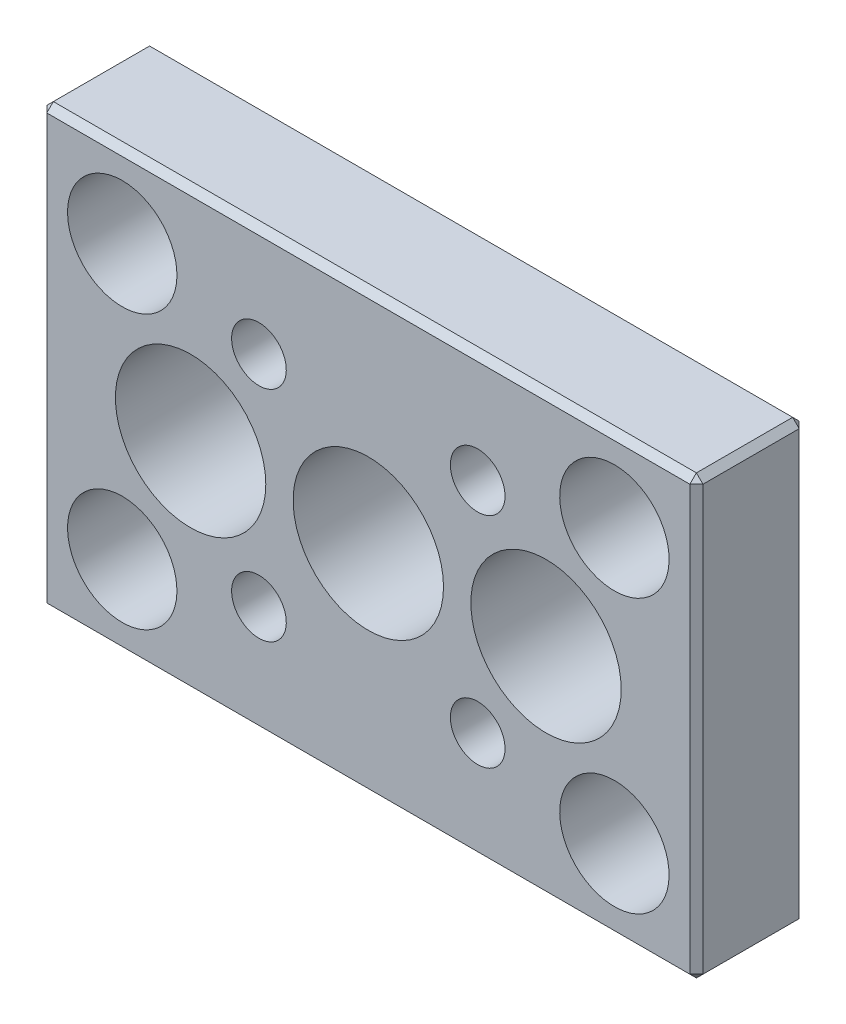
ISO-10303-21;
HEADER;
FILE_DESCRIPTION(('STEP AP214'),'2;1');
FILE_NAME('part.step','',(''),(''),'','','');
FILE_SCHEMA(('AUTOMOTIVE_DESIGN { 1 0 10303 214 1 1 1 1 }'));
ENDSEC;
DATA;
#1=APPLICATION_CONTEXT('core data for automotive mechanical design processes');
#2=APPLICATION_PROTOCOL_DEFINITION('international standard','automotive_design',2000,#1);
#3=PRODUCT_CONTEXT('',#1,'mechanical');
#4=PRODUCT('Part','Part','',(#3));
#5=PRODUCT_RELATED_PRODUCT_CATEGORY('part','',(#4));
#6=PRODUCT_DEFINITION_FORMATION('','',#4);
#7=PRODUCT_DEFINITION_CONTEXT('part definition',#1,'design');
#8=PRODUCT_DEFINITION('design','',#6,#7);
#9=PRODUCT_DEFINITION_SHAPE('','',#8);
#10=(LENGTH_UNIT() NAMED_UNIT(*) SI_UNIT(.MILLI.,.METRE.));
#11=(NAMED_UNIT(*) PLANE_ANGLE_UNIT() SI_UNIT($,.RADIAN.));
#12=(NAMED_UNIT(*) SI_UNIT($,.STERADIAN.) SOLID_ANGLE_UNIT());
#13=UNCERTAINTY_MEASURE_WITH_UNIT(LENGTH_MEASURE(1.E-05),#10,'distance_accuracy_value','');
#14=(GEOMETRIC_REPRESENTATION_CONTEXT(3) GLOBAL_UNCERTAINTY_ASSIGNED_CONTEXT((#13)) GLOBAL_UNIT_ASSIGNED_CONTEXT((#10,
#11,#12)) REPRESENTATION_CONTEXT('',''));
#15=CARTESIAN_POINT('',(0.,0.,0.));
#16=DIRECTION('',(0.,0.,1.));
#17=DIRECTION('',(1.,0.,0.));
#18=AXIS2_PLACEMENT_3D('',#15,#16,#17);
#19=CARTESIAN_POINT('',(-76.2,50.8,-25.4));
#20=DIRECTION('',(-1.,0.,0.));
#21=DIRECTION('',(0.,-1.,0.));
#22=AXIS2_PLACEMENT_3D('',#19,#20,#21);
#23=PLANE('',#22);
#24=DIRECTION('',(0.,0.,1.));
#25=VECTOR('',#24,1.);
#26=CARTESIAN_POINT('',(-76.2,-49.276,-25.4));
#27=LINE('',#26,#25);
#28=CARTESIAN_POINT('',(-76.2,-49.276,-23.876));
#29=VERTEX_POINT('',#28);
#30=CARTESIAN_POINT('',(-76.2,-49.276,-1.524));
#31=VERTEX_POINT('',#30);
#32=EDGE_CURVE('E191',#29,#31,#27,.T.);
#33=ORIENTED_EDGE('',*,*,#32,.T.);
#34=DIRECTION('',(0.,1.,0.));
#35=VECTOR('',#34,1.);
#36=CARTESIAN_POINT('',(-76.2,50.8,-1.524));
#37=LINE('',#36,#35);
#38=CARTESIAN_POINT('',(-76.2,49.276,-1.524));
#39=VERTEX_POINT('',#38);
#40=EDGE_CURVE('E197',#31,#39,#37,.T.);
#41=ORIENTED_EDGE('',*,*,#40,.T.);
#42=DIRECTION('',(0.,0.,-1.));
#43=VECTOR('',#42,1.);
#44=CARTESIAN_POINT('',(-76.2,49.276,-25.4));
#45=LINE('',#44,#43);
#46=CARTESIAN_POINT('',(-76.2,49.276,-23.876));
#47=VERTEX_POINT('',#46);
#48=EDGE_CURVE('E195',#39,#47,#45,.T.);
#49=ORIENTED_EDGE('',*,*,#48,.T.);
#50=DIRECTION('',(0.,-1.,0.));
#51=VECTOR('',#50,1.);
#52=CARTESIAN_POINT('',(-76.2,-50.8,-23.876));
#53=LINE('',#52,#51);
#54=EDGE_CURVE('E193',#47,#29,#53,.T.);
#55=ORIENTED_EDGE('',*,*,#54,.T.);
#56=EDGE_LOOP('',(#33,#41,#49,#55));
#57=FACE_BOUND('',#56,.T.);
#58=ADVANCED_FACE('F36',(#57),#23,.T.);
#59=CARTESIAN_POINT('',(-76.2,50.8,-25.4));
#60=DIRECTION('',(0.,1.,0.));
#61=DIRECTION('',(0.,0.,1.));
#62=AXIS2_PLACEMENT_3D('',#59,#60,#61);
#63=PLANE('',#62);
#64=DIRECTION('',(0.,0.,1.));
#65=VECTOR('',#64,1.);
#66=CARTESIAN_POINT('',(-74.676,50.8,-25.4));
#67=LINE('',#66,#65);
#68=CARTESIAN_POINT('',(-74.676,50.8,-23.876));
#69=VERTEX_POINT('',#68);
#70=CARTESIAN_POINT('',(-74.676,50.8,-1.52400000000001));
#71=VERTEX_POINT('',#70);
#72=EDGE_CURVE('E162',#69,#71,#67,.T.);
#73=ORIENTED_EDGE('',*,*,#72,.T.);
#74=DIRECTION('',(1.,0.,0.));
#75=VECTOR('',#74,1.);
#76=CARTESIAN_POINT('',(-76.2,50.8,-1.52400000000001));
#77=LINE('',#76,#75);
#78=CARTESIAN_POINT('',(74.676,50.8,-1.52400000000001));
#79=VERTEX_POINT('',#78);
#80=EDGE_CURVE('E131',#71,#79,#77,.T.);
#81=ORIENTED_EDGE('',*,*,#80,.T.);
#82=DIRECTION('',(0.,0.,-1.));
#83=VECTOR('',#82,1.);
#84=CARTESIAN_POINT('',(74.676,50.8,-25.4));
#85=LINE('',#84,#83);
#86=CARTESIAN_POINT('',(74.676,50.8,-23.876));
#87=VERTEX_POINT('',#86);
#88=EDGE_CURVE('E170',#79,#87,#85,.T.);
#89=ORIENTED_EDGE('',*,*,#88,.T.);
#90=DIRECTION('',(-1.,0.,0.));
#91=VECTOR('',#90,1.);
#92=CARTESIAN_POINT('',(-76.2,50.8,-23.876));
#93=LINE('',#92,#91);
#94=EDGE_CURVE('E164',#87,#69,#93,.T.);
#95=ORIENTED_EDGE('',*,*,#94,.T.);
#96=EDGE_LOOP('',(#73,#81,#89,#95));
#97=FACE_BOUND('',#96,.T.);
#98=ADVANCED_FACE('F291',(#97),#63,.T.);
#99=CARTESIAN_POINT('',(76.2,50.8,-25.4));
#100=DIRECTION('',(1.,0.,0.));
#101=DIRECTION('',(0.,1.,0.));
#102=AXIS2_PLACEMENT_3D('',#99,#100,#101);
#103=PLANE('',#102);
#104=DIRECTION('',(0.,0.,1.));
#105=VECTOR('',#104,1.);
#106=CARTESIAN_POINT('',(76.2,49.276,-25.4));
#107=LINE('',#106,#105);
#108=CARTESIAN_POINT('',(76.2,49.276,-23.876));
#109=VERTEX_POINT('',#108);
#110=CARTESIAN_POINT('',(76.2,49.276,-1.52400000000001));
#111=VERTEX_POINT('',#110);
#112=EDGE_CURVE('E173',#109,#111,#107,.T.);
#113=ORIENTED_EDGE('',*,*,#112,.T.);
#114=DIRECTION('',(0.,-1.,0.));
#115=VECTOR('',#114,1.);
#116=CARTESIAN_POINT('',(76.2,50.8,-1.52400000000001));
#117=LINE('',#116,#115);
#118=CARTESIAN_POINT('',(76.2,-49.276,-1.52400000000001));
#119=VERTEX_POINT('',#118);
#120=EDGE_CURVE('E179',#111,#119,#117,.T.);
#121=ORIENTED_EDGE('',*,*,#120,.T.);
#122=DIRECTION('',(0.,0.,-1.));
#123=VECTOR('',#122,1.);
#124=CARTESIAN_POINT('',(76.2,-49.276,-25.4));
#125=LINE('',#124,#123);
#126=CARTESIAN_POINT('',(76.2,-49.276,-23.876));
#127=VERTEX_POINT('',#126);
#128=EDGE_CURVE('E177',#119,#127,#125,.T.);
#129=ORIENTED_EDGE('',*,*,#128,.T.);
#130=DIRECTION('',(0.,1.,0.));
#131=VECTOR('',#130,1.);
#132=CARTESIAN_POINT('',(76.2,50.8,-23.876));
#133=LINE('',#132,#131);
#134=EDGE_CURVE('E175',#127,#109,#133,.T.);
#135=ORIENTED_EDGE('',*,*,#134,.T.);
#136=EDGE_LOOP('',(#113,#121,#129,#135));
#137=FACE_BOUND('',#136,.T.);
#138=ADVANCED_FACE('F297',(#137),#103,.T.);
#139=CARTESIAN_POINT('',(-76.2,-50.8,-25.4));
#140=DIRECTION('',(0.,-1.,0.));
#141=DIRECTION('',(0.,0.,-1.));
#142=AXIS2_PLACEMENT_3D('',#139,#140,#141);
#143=PLANE('',#142);
#144=DIRECTION('',(1.,0.,0.));
#145=VECTOR('',#144,1.);
#146=CARTESIAN_POINT('',(76.2,-50.8,-23.876));
#147=LINE('',#146,#145);
#148=CARTESIAN_POINT('',(-74.6759999999999,-50.8,-23.876));
#149=VERTEX_POINT('',#148);
#150=CARTESIAN_POINT('',(74.676,-50.8,-23.876));
#151=VERTEX_POINT('',#150);
#152=EDGE_CURVE('E184',#149,#151,#147,.T.);
#153=ORIENTED_EDGE('',*,*,#152,.T.);
#154=DIRECTION('',(0.,0.,1.));
#155=VECTOR('',#154,1.);
#156=CARTESIAN_POINT('',(74.676,-50.8,-25.4));
#157=LINE('',#156,#155);
#158=CARTESIAN_POINT('',(74.676,-50.8,-1.52400000000001));
#159=VERTEX_POINT('',#158);
#160=EDGE_CURVE('E189',#151,#159,#157,.T.);
#161=ORIENTED_EDGE('',*,*,#160,.T.);
#162=DIRECTION('',(-1.,0.,0.));
#163=VECTOR('',#162,1.);
#164=CARTESIAN_POINT('',(-76.2,-50.8,-1.52400000000001));
#165=LINE('',#164,#163);
#166=CARTESIAN_POINT('',(-74.6759999999999,-50.8,-1.52400000000001));
#167=VERTEX_POINT('',#166);
#168=EDGE_CURVE('E186',#159,#167,#165,.T.);
#169=ORIENTED_EDGE('',*,*,#168,.T.);
#170=DIRECTION('',(0.,0.,-1.));
#171=VECTOR('',#170,1.);
#172=CARTESIAN_POINT('',(-74.6759999999999,-50.8,-25.4));
#173=LINE('',#172,#171);
#174=EDGE_CURVE('E182',#167,#149,#173,.T.);
#175=ORIENTED_EDGE('',*,*,#174,.T.);
#176=EDGE_LOOP('',(#153,#161,#169,#175));
#177=FACE_BOUND('',#176,.T.);
#178=ADVANCED_FACE('F284',(#177),#143,.T.);
#179=CARTESIAN_POINT('',(-76.2,-50.8,-25.4));
#180=DIRECTION('',(0.,0.,1.));
#181=DIRECTION('',(1.,0.,0.));
#182=AXIS2_PLACEMENT_3D('',#179,#180,#181);
#183=PLANE('',#182);
#184=CARTESIAN_POINT('',(0.,0.,-25.4));
#185=DIRECTION('',(0.,0.,1.));
#186=DIRECTION('',(1.,0.,0.));
#187=AXIS2_PLACEMENT_3D('',#184,#185,#186);
#188=CIRCLE('',#187,17.4625);
#189=CARTESIAN_POINT('',(17.4625,0.,-25.4));
#190=VERTEX_POINT('',#189);
#191=EDGE_CURVE('E683',#190,#190,#188,.T.);
#192=ORIENTED_EDGE('',*,*,#191,.T.);
#193=EDGE_LOOP('',(#192));
#194=FACE_BOUND('',#193,.T.);
#195=CARTESIAN_POINT('',(41.275,0.,-25.4));
#196=DIRECTION('',(0.,0.,1.));
#197=DIRECTION('',(1.,0.,0.));
#198=AXIS2_PLACEMENT_3D('',#195,#196,#197);
#199=CIRCLE('',#198,17.4625);
#200=CARTESIAN_POINT('',(58.7375,0.,-25.4));
#201=VERTEX_POINT('',#200);
#202=EDGE_CURVE('E134',#201,#201,#199,.T.);
#203=ORIENTED_EDGE('',*,*,#202,.T.);
#204=EDGE_LOOP('',(#203));
#205=FACE_BOUND('',#204,.T.);
#206=DIRECTION('',(0.,-1.,0.));
#207=VECTOR('',#206,1.);
#208=CARTESIAN_POINT('',(74.676,-50.8,-25.4));
#209=LINE('',#208,#207);
#210=CARTESIAN_POINT('',(74.676,49.276,-25.4));
#211=VERTEX_POINT('',#210);
#212=CARTESIAN_POINT('',(74.676,-49.276,-25.4));
#213=VERTEX_POINT('',#212);
#214=EDGE_CURVE('E51',#211,#213,#209,.T.);
#215=ORIENTED_EDGE('',*,*,#214,.T.);
#216=DIRECTION('',(-1.,0.,0.));
#217=VECTOR('',#216,1.);
#218=CARTESIAN_POINT('',(-76.2,-49.276,-25.4));
#219=LINE('',#218,#217);
#220=CARTESIAN_POINT('',(-74.6759999999999,-49.276,-25.4));
#221=VERTEX_POINT('',#220);
#222=EDGE_CURVE('E204',#213,#221,#219,.T.);
#223=ORIENTED_EDGE('',*,*,#222,.T.);
#224=DIRECTION('',(0.,1.,0.));
#225=VECTOR('',#224,1.);
#226=CARTESIAN_POINT('',(-74.676,50.8,-25.4));
#227=LINE('',#226,#225);
#228=CARTESIAN_POINT('',(-74.676,49.276,-25.4));
#229=VERTEX_POINT('',#228);
#230=EDGE_CURVE('E200',#221,#229,#227,.T.);
#231=ORIENTED_EDGE('',*,*,#230,.T.);
#232=DIRECTION('',(1.,0.,0.));
#233=VECTOR('',#232,1.);
#234=CARTESIAN_POINT('',(76.2,49.276,-25.4));
#235=LINE('',#234,#233);
#236=EDGE_CURVE('E56',#229,#211,#235,.T.);
#237=ORIENTED_EDGE('',*,*,#236,.T.);
#238=EDGE_LOOP('',(#215,#223,#231,#237));
#239=FACE_BOUND('',#238,.T.);
#240=CARTESIAN_POINT('',(-57.15,31.75,-25.4));
#241=DIRECTION('',(0.,0.,-1.));
#242=DIRECTION('',(0.,1.,0.));
#243=AXIS2_PLACEMENT_3D('',#240,#241,#242);
#244=CIRCLE('',#243,12.7);
#245=CARTESIAN_POINT('',(-57.15,44.45,-25.4));
#246=VERTEX_POINT('',#245);
#247=EDGE_CURVE('E262',#246,#246,#244,.T.);
#248=ORIENTED_EDGE('',*,*,#247,.F.);
#249=EDGE_LOOP('',(#248));
#250=FACE_BOUND('',#249,.T.);
#251=CARTESIAN_POINT('',(57.15,31.75,-25.4));
#252=DIRECTION('',(0.,0.,-1.));
#253=DIRECTION('',(0.,1.,0.));
#254=AXIS2_PLACEMENT_3D('',#251,#252,#253);
#255=CIRCLE('',#254,12.7);
#256=CARTESIAN_POINT('',(57.15,44.45,-25.4));
#257=VERTEX_POINT('',#256);
#258=EDGE_CURVE('E665',#257,#257,#255,.T.);
#259=ORIENTED_EDGE('',*,*,#258,.F.);
#260=EDGE_LOOP('',(#259));
#261=FACE_BOUND('',#260,.T.);
#262=CARTESIAN_POINT('',(-57.15,-31.75,-25.4));
#263=DIRECTION('',(0.,0.,-1.));
#264=DIRECTION('',(0.,1.,0.));
#265=AXIS2_PLACEMENT_3D('',#262,#263,#264);
#266=CIRCLE('',#265,12.7);
#267=CARTESIAN_POINT('',(-57.15,-19.05,-25.4));
#268=VERTEX_POINT('',#267);
#269=EDGE_CURVE('E659',#268,#268,#266,.T.);
#270=ORIENTED_EDGE('',*,*,#269,.F.);
#271=EDGE_LOOP('',(#270));
#272=FACE_BOUND('',#271,.T.);
#273=CARTESIAN_POINT('',(57.15,-31.75,-25.4));
#274=DIRECTION('',(0.,0.,-1.));
#275=DIRECTION('',(0.,1.,0.));
#276=AXIS2_PLACEMENT_3D('',#273,#274,#275);
#277=CIRCLE('',#276,12.7);
#278=CARTESIAN_POINT('',(57.15,-19.05,-25.4));
#279=VERTEX_POINT('',#278);
#280=EDGE_CURVE('E653',#279,#279,#277,.T.);
#281=ORIENTED_EDGE('',*,*,#280,.F.);
#282=EDGE_LOOP('',(#281));
#283=FACE_BOUND('',#282,.T.);
#284=CARTESIAN_POINT('',(25.4,25.4,-25.4));
#285=DIRECTION('',(0.,0.,-1.));
#286=DIRECTION('',(0.,1.,0.));
#287=AXIS2_PLACEMENT_3D('',#284,#285,#286);
#288=CIRCLE('',#287,6.35);
#289=CARTESIAN_POINT('',(25.4,31.75,-25.4));
#290=VERTEX_POINT('',#289);
#291=EDGE_CURVE('E615',#290,#290,#288,.T.);
#292=ORIENTED_EDGE('',*,*,#291,.F.);
#293=EDGE_LOOP('',(#292));
#294=FACE_BOUND('',#293,.T.);
#295=CARTESIAN_POINT('',(-25.4,25.4,-25.4));
#296=DIRECTION('',(0.,0.,-1.));
#297=DIRECTION('',(0.,1.,0.));
#298=AXIS2_PLACEMENT_3D('',#295,#296,#297);
#299=CIRCLE('',#298,6.35);
#300=CARTESIAN_POINT('',(-25.4,31.75,-25.4));
#301=VERTEX_POINT('',#300);
#302=EDGE_CURVE('E617',#301,#301,#299,.T.);
#303=ORIENTED_EDGE('',*,*,#302,.F.);
#304=EDGE_LOOP('',(#303));
#305=FACE_BOUND('',#304,.T.);
#306=CARTESIAN_POINT('',(-25.4,-25.4,-25.4));
#307=DIRECTION('',(0.,0.,-1.));
#308=DIRECTION('',(0.,1.,0.));
#309=AXIS2_PLACEMENT_3D('',#306,#307,#308);
#310=CIRCLE('',#309,6.35);
#311=CARTESIAN_POINT('',(-25.4,-19.05,-25.4));
#312=VERTEX_POINT('',#311);
#313=EDGE_CURVE('E631',#312,#312,#310,.T.);
#314=ORIENTED_EDGE('',*,*,#313,.F.);
#315=EDGE_LOOP('',(#314));
#316=FACE_BOUND('',#315,.T.);
#317=CARTESIAN_POINT('',(25.4,-25.4,-25.4));
#318=DIRECTION('',(0.,0.,-1.));
#319=DIRECTION('',(0.,1.,0.));
#320=AXIS2_PLACEMENT_3D('',#317,#318,#319);
#321=CIRCLE('',#320,6.35);
#322=CARTESIAN_POINT('',(25.4,-19.05,-25.4));
#323=VERTEX_POINT('',#322);
#324=EDGE_CURVE('E155',#323,#323,#321,.T.);
#325=ORIENTED_EDGE('',*,*,#324,.F.);
#326=EDGE_LOOP('',(#325));
#327=FACE_BOUND('',#326,.T.);
#328=CARTESIAN_POINT('',(-41.275,0.,-25.4));
#329=DIRECTION('',(0.,0.,1.));
#330=DIRECTION('',(1.,0.,0.));
#331=AXIS2_PLACEMENT_3D('',#328,#329,#330);
#332=CIRCLE('',#331,17.4625);
#333=CARTESIAN_POINT('',(-23.8125,0.,-25.4));
#334=VERTEX_POINT('',#333);
#335=EDGE_CURVE('E44',#334,#334,#332,.T.);
#336=ORIENTED_EDGE('',*,*,#335,.T.);
#337=EDGE_LOOP('',(#336));
#338=FACE_BOUND('',#337,.T.);
#339=ADVANCED_FACE('F266',(#194,#205,#239,#250,#261,#272,#283,#294,#305,#316,#327,#338),#183,.F.);
#340=CARTESIAN_POINT('',(-76.2,-50.8,0.));
#341=DIRECTION('',(0.,0.,1.));
#342=DIRECTION('',(1.,0.,0.));
#343=AXIS2_PLACEMENT_3D('',#340,#341,#342);
#344=PLANE('',#343);
#345=CARTESIAN_POINT('',(0.,0.,0.));
#346=DIRECTION('',(0.,0.,1.));
#347=DIRECTION('',(1.,0.,0.));
#348=AXIS2_PLACEMENT_3D('',#345,#346,#347);
#349=CIRCLE('',#348,17.4625);
#350=CARTESIAN_POINT('',(17.4625,0.,0.));
#351=VERTEX_POINT('',#350);
#352=EDGE_CURVE('E678',#351,#351,#349,.T.);
#353=ORIENTED_EDGE('',*,*,#352,.F.);
#354=EDGE_LOOP('',(#353));
#355=FACE_BOUND('',#354,.T.);
#356=CARTESIAN_POINT('',(41.275,0.,0.));
#357=DIRECTION('',(0.,0.,1.));
#358=DIRECTION('',(1.,0.,0.));
#359=AXIS2_PLACEMENT_3D('',#356,#357,#358);
#360=CIRCLE('',#359,17.4625);
#361=CARTESIAN_POINT('',(58.7375,0.,0.));
#362=VERTEX_POINT('',#361);
#363=EDGE_CURVE('E675',#362,#362,#360,.T.);
#364=ORIENTED_EDGE('',*,*,#363,.F.);
#365=EDGE_LOOP('',(#364));
#366=FACE_BOUND('',#365,.T.);
#367=DIRECTION('',(0.,1.,0.));
#368=VECTOR('',#367,1.);
#369=CARTESIAN_POINT('',(74.676,-50.8,0.));
#370=LINE('',#369,#368);
#371=CARTESIAN_POINT('',(74.676,-49.276,0.));
#372=VERTEX_POINT('',#371);
#373=CARTESIAN_POINT('',(74.676,49.276,0.));
#374=VERTEX_POINT('',#373);
#375=EDGE_CURVE('E160',#372,#374,#370,.T.);
#376=ORIENTED_EDGE('',*,*,#375,.T.);
#377=DIRECTION('',(-1.,0.,0.));
#378=VECTOR('',#377,1.);
#379=CARTESIAN_POINT('',(-76.2,49.276,0.));
#380=LINE('',#379,#378);
#381=CARTESIAN_POINT('',(-74.676,49.276,0.));
#382=VERTEX_POINT('',#381);
#383=EDGE_CURVE('E129',#374,#382,#380,.T.);
#384=ORIENTED_EDGE('',*,*,#383,.T.);
#385=DIRECTION('',(0.,-1.,0.));
#386=VECTOR('',#385,1.);
#387=CARTESIAN_POINT('',(-74.6759999999999,-50.8,0.));
#388=LINE('',#387,#386);
#389=CARTESIAN_POINT('',(-74.6759999999999,-49.276,0.));
#390=VERTEX_POINT('',#389);
#391=EDGE_CURVE('E148',#382,#390,#388,.T.);
#392=ORIENTED_EDGE('',*,*,#391,.T.);
#393=DIRECTION('',(1.,0.,0.));
#394=VECTOR('',#393,1.);
#395=CARTESIAN_POINT('',(-76.2,-49.276,0.));
#396=LINE('',#395,#394);
#397=EDGE_CURVE('E154',#390,#372,#396,.T.);
#398=ORIENTED_EDGE('',*,*,#397,.T.);
#399=EDGE_LOOP('',(#376,#384,#392,#398));
#400=FACE_BOUND('',#399,.T.);
#401=CARTESIAN_POINT('',(-57.15,31.75,0.));
#402=DIRECTION('',(0.,0.,-1.));
#403=DIRECTION('',(0.,1.,0.));
#404=AXIS2_PLACEMENT_3D('',#401,#402,#403);
#405=CIRCLE('',#404,12.7);
#406=CARTESIAN_POINT('',(-57.15,44.45,0.));
#407=VERTEX_POINT('',#406);
#408=EDGE_CURVE('E668',#407,#407,#405,.T.);
#409=ORIENTED_EDGE('',*,*,#408,.T.);
#410=EDGE_LOOP('',(#409));
#411=FACE_BOUND('',#410,.T.);
#412=CARTESIAN_POINT('',(57.15,31.75,0.));
#413=DIRECTION('',(0.,0.,-1.));
#414=DIRECTION('',(0.,1.,0.));
#415=AXIS2_PLACEMENT_3D('',#412,#413,#414);
#416=CIRCLE('',#415,12.7);
#417=CARTESIAN_POINT('',(57.15,44.45,0.));
#418=VERTEX_POINT('',#417);
#419=EDGE_CURVE('E662',#418,#418,#416,.T.);
#420=ORIENTED_EDGE('',*,*,#419,.T.);
#421=EDGE_LOOP('',(#420));
#422=FACE_BOUND('',#421,.T.);
#423=CARTESIAN_POINT('',(-57.15,-31.75,0.));
#424=DIRECTION('',(0.,0.,-1.));
#425=DIRECTION('',(0.,1.,0.));
#426=AXIS2_PLACEMENT_3D('',#423,#424,#425);
#427=CIRCLE('',#426,12.7);
#428=CARTESIAN_POINT('',(-57.15,-19.05,0.));
#429=VERTEX_POINT('',#428);
#430=EDGE_CURVE('E656',#429,#429,#427,.T.);
#431=ORIENTED_EDGE('',*,*,#430,.T.);
#432=EDGE_LOOP('',(#431));
#433=FACE_BOUND('',#432,.T.);
#434=CARTESIAN_POINT('',(57.15,-31.75,0.));
#435=DIRECTION('',(0.,0.,-1.));
#436=DIRECTION('',(0.,1.,0.));
#437=AXIS2_PLACEMENT_3D('',#434,#435,#436);
#438=CIRCLE('',#437,12.7);
#439=CARTESIAN_POINT('',(57.15,-19.05,0.));
#440=VERTEX_POINT('',#439);
#441=EDGE_CURVE('E622',#440,#440,#438,.T.);
#442=ORIENTED_EDGE('',*,*,#441,.T.);
#443=EDGE_LOOP('',(#442));
#444=FACE_BOUND('',#443,.T.);
#445=CARTESIAN_POINT('',(25.4,25.4,0.));
#446=DIRECTION('',(0.,0.,-1.));
#447=DIRECTION('',(0.,1.,0.));
#448=AXIS2_PLACEMENT_3D('',#445,#446,#447);
#449=CIRCLE('',#448,6.35);
#450=CARTESIAN_POINT('',(25.4,31.75,0.));
#451=VERTEX_POINT('',#450);
#452=EDGE_CURVE('E612',#451,#451,#449,.T.);
#453=ORIENTED_EDGE('',*,*,#452,.T.);
#454=EDGE_LOOP('',(#453));
#455=FACE_BOUND('',#454,.T.);
#456=CARTESIAN_POINT('',(-25.4,25.4,0.));
#457=DIRECTION('',(0.,0.,-1.));
#458=DIRECTION('',(0.,1.,0.));
#459=AXIS2_PLACEMENT_3D('',#456,#457,#458);
#460=CIRCLE('',#459,6.35);
#461=CARTESIAN_POINT('',(-25.4,31.75,0.));
#462=VERTEX_POINT('',#461);
#463=EDGE_CURVE('E620',#462,#462,#460,.T.);
#464=ORIENTED_EDGE('',*,*,#463,.T.);
#465=EDGE_LOOP('',(#464));
#466=FACE_BOUND('',#465,.T.);
#467=CARTESIAN_POINT('',(-25.4,-25.4,0.));
#468=DIRECTION('',(0.,0.,-1.));
#469=DIRECTION('',(0.,1.,0.));
#470=AXIS2_PLACEMENT_3D('',#467,#468,#469);
#471=CIRCLE('',#470,6.35);
#472=CARTESIAN_POINT('',(-25.4,-19.05,0.));
#473=VERTEX_POINT('',#472);
#474=EDGE_CURVE('E627',#473,#473,#471,.T.);
#475=ORIENTED_EDGE('',*,*,#474,.T.);
#476=EDGE_LOOP('',(#475));
#477=FACE_BOUND('',#476,.T.);
#478=CARTESIAN_POINT('',(25.4,-25.4,0.));
#479=DIRECTION('',(0.,0.,-1.));
#480=DIRECTION('',(0.,1.,0.));
#481=AXIS2_PLACEMENT_3D('',#478,#479,#480);
#482=CIRCLE('',#481,6.35);
#483=CARTESIAN_POINT('',(25.4,-19.05,0.));
#484=VERTEX_POINT('',#483);
#485=EDGE_CURVE('E634',#484,#484,#482,.T.);
#486=ORIENTED_EDGE('',*,*,#485,.T.);
#487=EDGE_LOOP('',(#486));
#488=FACE_BOUND('',#487,.T.);
#489=CARTESIAN_POINT('',(-41.275,0.,0.));
#490=DIRECTION('',(0.,0.,1.));
#491=DIRECTION('',(1.,0.,0.));
#492=AXIS2_PLACEMENT_3D('',#489,#490,#491);
#493=CIRCLE('',#492,17.4625);
#494=CARTESIAN_POINT('',(-23.8125,0.,0.));
#495=VERTEX_POINT('',#494);
#496=EDGE_CURVE('E11',#495,#495,#493,.T.);
#497=ORIENTED_EDGE('',*,*,#496,.F.);
#498=EDGE_LOOP('',(#497));
#499=FACE_BOUND('',#498,.T.);
#500=ADVANCED_FACE('F157',(#355,#366,#400,#411,#422,#433,#444,#455,#466,#477,#488,#499),#344,.T.);
#501=CARTESIAN_POINT('',(-25.4,25.4,0.));
#502=DIRECTION('',(0.,0.,-1.));
#503=DIRECTION('',(0.,1.,0.));
#504=AXIS2_PLACEMENT_3D('',#501,#502,#503);
#505=CYLINDRICAL_SURFACE('',#504,6.35);
#506=ORIENTED_EDGE('',*,*,#463,.F.);
#507=EDGE_LOOP('',(#506));
#508=FACE_BOUND('',#507,.T.);
#509=ORIENTED_EDGE('',*,*,#302,.T.);
#510=EDGE_LOOP('',(#509));
#511=FACE_BOUND('',#510,.T.);
#512=ADVANCED_FACE('F274',(#508,#511),#505,.F.);
#513=CARTESIAN_POINT('',(25.4,25.4,0.));
#514=DIRECTION('',(0.,0.,-1.));
#515=DIRECTION('',(0.,1.,0.));
#516=AXIS2_PLACEMENT_3D('',#513,#514,#515);
#517=CYLINDRICAL_SURFACE('',#516,6.35);
#518=ORIENTED_EDGE('',*,*,#452,.F.);
#519=EDGE_LOOP('',(#518));
#520=FACE_BOUND('',#519,.T.);
#521=ORIENTED_EDGE('',*,*,#291,.T.);
#522=EDGE_LOOP('',(#521));
#523=FACE_BOUND('',#522,.T.);
#524=ADVANCED_FACE('F281',(#520,#523),#517,.F.);
#525=CARTESIAN_POINT('',(-25.4,-25.4,0.));
#526=DIRECTION('',(0.,0.,-1.));
#527=DIRECTION('',(0.,1.,0.));
#528=AXIS2_PLACEMENT_3D('',#525,#526,#527);
#529=CYLINDRICAL_SURFACE('',#528,6.35);
#530=ORIENTED_EDGE('',*,*,#474,.F.);
#531=EDGE_LOOP('',(#530));
#532=FACE_BOUND('',#531,.T.);
#533=ORIENTED_EDGE('',*,*,#313,.T.);
#534=EDGE_LOOP('',(#533));
#535=FACE_BOUND('',#534,.T.);
#536=ADVANCED_FACE('F302',(#532,#535),#529,.F.);
#537=CARTESIAN_POINT('',(25.4,-25.4,0.));
#538=DIRECTION('',(0.,0.,-1.));
#539=DIRECTION('',(0.,1.,0.));
#540=AXIS2_PLACEMENT_3D('',#537,#538,#539);
#541=CYLINDRICAL_SURFACE('',#540,6.35);
#542=ORIENTED_EDGE('',*,*,#485,.F.);
#543=EDGE_LOOP('',(#542));
#544=FACE_BOUND('',#543,.T.);
#545=ORIENTED_EDGE('',*,*,#324,.T.);
#546=EDGE_LOOP('',(#545));
#547=FACE_BOUND('',#546,.T.);
#548=ADVANCED_FACE('F305',(#544,#547),#541,.F.);
#549=CARTESIAN_POINT('',(57.15,-31.75,0.));
#550=DIRECTION('',(0.,0.,-1.));
#551=DIRECTION('',(0.,1.,0.));
#552=AXIS2_PLACEMENT_3D('',#549,#550,#551);
#553=CYLINDRICAL_SURFACE('',#552,12.7);
#554=ORIENTED_EDGE('',*,*,#441,.F.);
#555=EDGE_LOOP('',(#554));
#556=FACE_BOUND('',#555,.T.);
#557=ORIENTED_EDGE('',*,*,#280,.T.);
#558=EDGE_LOOP('',(#557));
#559=FACE_BOUND('',#558,.T.);
#560=ADVANCED_FACE('F309',(#556,#559),#553,.F.);
#561=CARTESIAN_POINT('',(-57.15,-31.75,0.));
#562=DIRECTION('',(0.,0.,-1.));
#563=DIRECTION('',(0.,1.,0.));
#564=AXIS2_PLACEMENT_3D('',#561,#562,#563);
#565=CYLINDRICAL_SURFACE('',#564,12.7);
#566=CARTESIAN_POINT('',(-57.15,-19.05,0.));
#567=CARTESIAN_POINT('',(-57.15,-19.05,-0.264583333333327));
#568=CARTESIAN_POINT('',(-57.15,-19.05,-0.529166666666661));
#569=CARTESIAN_POINT('',(-57.15,-19.05,-1.05833333333333));
#570=CARTESIAN_POINT('',(-57.15,-19.05,-1.32291666666666));
#571=CARTESIAN_POINT('',(-57.15,-19.05,-1.85208333333333));
#572=CARTESIAN_POINT('',(-57.15,-19.05,-2.11666666666666));
#573=CARTESIAN_POINT('',(-57.15,-19.05,-2.64583333333333));
#574=CARTESIAN_POINT('',(-57.15,-19.05,-2.91041666666666));
#575=CARTESIAN_POINT('',(-57.15,-19.05,-3.43958333333333));
#576=CARTESIAN_POINT('',(-57.15,-19.05,-3.70416666666666));
#577=CARTESIAN_POINT('',(-57.15,-19.05,-4.23333333333333));
#578=CARTESIAN_POINT('',(-57.15,-19.05,-4.49791666666666));
#579=CARTESIAN_POINT('',(-57.15,-19.05,-5.02708333333333));
#580=CARTESIAN_POINT('',(-57.15,-19.05,-5.29166666666666));
#581=CARTESIAN_POINT('',(-57.15,-19.05,-5.82083333333333));
#582=CARTESIAN_POINT('',(-57.15,-19.05,-6.08541666666666));
#583=CARTESIAN_POINT('',(-57.15,-19.05,-6.61458333333333));
#584=CARTESIAN_POINT('',(-57.15,-19.05,-6.87916666666666));
#585=CARTESIAN_POINT('',(-57.15,-19.05,-7.40833333333333));
#586=CARTESIAN_POINT('',(-57.15,-19.05,-7.67291666666666));
#587=CARTESIAN_POINT('',(-57.15,-19.05,-8.20208333333333));
#588=CARTESIAN_POINT('',(-57.15,-19.05,-8.46666666666666));
#589=CARTESIAN_POINT('',(-57.15,-19.05,-8.99583333333333));
#590=CARTESIAN_POINT('',(-57.15,-19.05,-9.26041666666666));
#591=CARTESIAN_POINT('',(-57.15,-19.05,-9.78958333333333));
#592=CARTESIAN_POINT('',(-57.15,-19.05,-10.0541666666667));
#593=CARTESIAN_POINT('',(-57.15,-19.05,-10.5833333333333));
#594=CARTESIAN_POINT('',(-57.15,-19.05,-10.8479166666667));
#595=CARTESIAN_POINT('',(-57.15,-19.05,-11.3770833333333));
#596=CARTESIAN_POINT('',(-57.15,-19.05,-11.6416666666667));
#597=CARTESIAN_POINT('',(-57.15,-19.05,-12.1708333333333));
#598=CARTESIAN_POINT('',(-57.15,-19.05,-12.4354166666667));
#599=CARTESIAN_POINT('',(-57.15,-19.05,-12.9645833333333));
#600=CARTESIAN_POINT('',(-57.15,-19.05,-13.2291666666667));
#601=CARTESIAN_POINT('',(-57.15,-19.05,-13.7583333333333));
#602=CARTESIAN_POINT('',(-57.15,-19.05,-14.0229166666667));
#603=CARTESIAN_POINT('',(-57.15,-19.05,-14.5520833333333));
#604=CARTESIAN_POINT('',(-57.15,-19.05,-14.8166666666667));
#605=CARTESIAN_POINT('',(-57.15,-19.05,-15.3458333333333));
#606=CARTESIAN_POINT('',(-57.15,-19.05,-15.6104166666667));
#607=CARTESIAN_POINT('',(-57.15,-19.05,-16.1395833333333));
#608=CARTESIAN_POINT('',(-57.15,-19.05,-16.4041666666667));
#609=CARTESIAN_POINT('',(-57.15,-19.05,-16.9333333333333));
#610=CARTESIAN_POINT('',(-57.15,-19.05,-17.1979166666667));
#611=CARTESIAN_POINT('',(-57.15,-19.05,-17.7270833333333));
#612=CARTESIAN_POINT('',(-57.15,-19.05,-17.9916666666667));
#613=CARTESIAN_POINT('',(-57.15,-19.05,-18.5208333333333));
#614=CARTESIAN_POINT('',(-57.15,-19.05,-18.7854166666667));
#615=CARTESIAN_POINT('',(-57.15,-19.05,-19.3145833333333));
#616=CARTESIAN_POINT('',(-57.15,-19.05,-19.5791666666667));
#617=CARTESIAN_POINT('',(-57.15,-19.05,-20.1083333333333));
#618=CARTESIAN_POINT('',(-57.15,-19.05,-20.3729166666667));
#619=CARTESIAN_POINT('',(-57.15,-19.05,-20.9020833333333));
#620=CARTESIAN_POINT('',(-57.15,-19.05,-21.1666666666667));
#621=CARTESIAN_POINT('',(-57.15,-19.05,-21.6958333333333));
#622=CARTESIAN_POINT('',(-57.15,-19.05,-21.9604166666667));
#623=CARTESIAN_POINT('',(-57.15,-19.05,-22.4895833333333));
#624=CARTESIAN_POINT('',(-57.15,-19.05,-22.7541666666667));
#625=CARTESIAN_POINT('',(-57.15,-19.05,-23.2833333333333));
#626=CARTESIAN_POINT('',(-57.15,-19.05,-23.5479166666667));
#627=CARTESIAN_POINT('',(-57.15,-19.05,-24.0770833333333));
#628=CARTESIAN_POINT('',(-57.15,-19.05,-24.3416666666667));
#629=CARTESIAN_POINT('',(-57.15,-19.05,-24.8708333333333));
#630=CARTESIAN_POINT('',(-57.15,-19.05,-25.1354166666667));
#631=CARTESIAN_POINT('',(-57.15,-19.05,-25.4));
#632=B_SPLINE_CURVE_WITH_KNOTS('',3,(#566,#567,#568,#569,#570,#571,#572,#573,#574,#575,#576,
#577,#578,#579,#580,#581,#582,#583,#584,#585,#586,#587,#588,#589,#590,#591,#592,#593,#594,#595,
#596,#597,#598,#599,#600,#601,#602,#603,#604,#605,#606,#607,#608,#609,#610,#611,#612,#613,#614,
#615,#616,#617,#618,#619,#620,#621,#622,#623,#624,#625,#626,#627,#628,#629,#630,#631),
.UNSPECIFIED.,.F.,.F.,(4,2,2,2,2,2,2,2,2,2,2,2,2,2,2,2,2,2,2,2,2,2,2,2,2,2,2,2,2,2,2,2,4),(0.,
0.79375,1.5875,2.38125,3.175,3.96875,4.7625,5.55625,6.35,7.14375,7.9375,8.73125,9.525,10.31875,
11.1125,11.90625,12.7,13.49375,14.2875,15.08125,15.875,16.66875,17.4625,18.25625,19.05,19.84375,
20.6375,21.43125,22.225,23.01875,23.8125,24.60625,25.4),.UNSPECIFIED.);
#633=EDGE_CURVE('BSEAM560',#429,#268,#632,.T.);
#634=ORIENTED_EDGE('',*,*,#430,.F.);
#635=ORIENTED_EDGE('',*,*,#269,.T.);
#636=ORIENTED_EDGE('',*,*,#633,.T.);
#637=ORIENTED_EDGE('',*,*,#633,.F.);
#638=EDGE_LOOP('',(#634,#636,#635,#637));
#639=FACE_BOUND('',#638,.T.);
#640=ADVANCED_FACE('F560',(#639),#565,.F.);
#641=CARTESIAN_POINT('',(57.15,31.75,0.));
#642=DIRECTION('',(0.,0.,-1.));
#643=DIRECTION('',(0.,1.,0.));
#644=AXIS2_PLACEMENT_3D('',#641,#642,#643);
#645=CYLINDRICAL_SURFACE('',#644,12.7);
#646=ORIENTED_EDGE('',*,*,#419,.F.);
#647=EDGE_LOOP('',(#646));
#648=FACE_BOUND('',#647,.T.);
#649=ORIENTED_EDGE('',*,*,#258,.T.);
#650=EDGE_LOOP('',(#649));
#651=FACE_BOUND('',#650,.T.);
#652=ADVANCED_FACE('F388',(#648,#651),#645,.F.);
#653=CARTESIAN_POINT('',(-57.15,31.75,0.));
#654=DIRECTION('',(0.,0.,-1.));
#655=DIRECTION('',(0.,1.,0.));
#656=AXIS2_PLACEMENT_3D('',#653,#654,#655);
#657=CYLINDRICAL_SURFACE('',#656,12.7);
#658=ORIENTED_EDGE('',*,*,#408,.F.);
#659=EDGE_LOOP('',(#658));
#660=FACE_BOUND('',#659,.T.);
#661=ORIENTED_EDGE('',*,*,#247,.T.);
#662=EDGE_LOOP('',(#661));
#663=FACE_BOUND('',#662,.T.);
#664=ADVANCED_FACE('F383',(#660,#663),#657,.F.);
#665=CARTESIAN_POINT('',(-76.2,-50.8,-23.876));
#666=DIRECTION('',(0.,-0.707106781186551,-0.707106781186544));
#667=DIRECTION('',(0.,0.707106781186544,-0.707106781186551));
#668=AXIS2_PLACEMENT_3D('',#665,#666,#667);
#669=PLANE('',#668);
#670=DIRECTION('',(0.,0.707106781186544,-0.707106781186551));
#671=VECTOR('',#670,1.);
#672=CARTESIAN_POINT('',(74.676,-50.8,-23.876));
#673=LINE('',#672,#671);
#674=EDGE_CURVE('E260',#151,#213,#673,.T.);
#675=ORIENTED_EDGE('',*,*,#674,.F.);
#676=ORIENTED_EDGE('',*,*,#152,.F.);
#677=DIRECTION('',(0.,-0.707106781186544,0.707106781186551));
#678=VECTOR('',#677,1.);
#679=CARTESIAN_POINT('',(-74.6759999999999,-49.276,-25.4));
#680=LINE('',#679,#678);
#681=EDGE_CURVE('E257',#221,#149,#680,.T.);
#682=ORIENTED_EDGE('',*,*,#681,.F.);
#683=ORIENTED_EDGE('',*,*,#222,.F.);
#684=EDGE_LOOP('',(#675,#676,#682,#683));
#685=FACE_BOUND('',#684,.T.);
#686=ADVANCED_FACE('F380',(#685),#669,.T.);
#687=CARTESIAN_POINT('',(74.676,-50.8,-23.876));
#688=DIRECTION('',(0.577350269189617,-0.577350269189633,-0.577350269189628));
#689=DIRECTION('',(0.,0.707106781186544,-0.707106781186551));
#690=AXIS2_PLACEMENT_3D('',#687,#688,#689);
#691=PLANE('',#690);
#692=DIRECTION('',(0.707106781186554,0.707106781186541,0.));
#693=VECTOR('',#692,1.);
#694=CARTESIAN_POINT('',(74.676,-50.8,-23.876));
#695=LINE('',#694,#693);
#696=EDGE_CURVE('E251',#151,#127,#695,.T.);
#697=ORIENTED_EDGE('',*,*,#696,.F.);
#698=ORIENTED_EDGE('',*,*,#674,.T.);
#699=DIRECTION('',(0.707106781186554,0.,0.707106781186541));
#700=VECTOR('',#699,1.);
#701=CARTESIAN_POINT('',(75.438,-49.276,-24.638));
#702=LINE('',#701,#700);
#703=EDGE_CURVE('E254',#127,#213,#702,.F.);
#704=ORIENTED_EDGE('',*,*,#703,.F.);
#705=EDGE_LOOP('',(#697,#698,#704));
#706=FACE_BOUND('',#705,.T.);
#707=ADVANCED_FACE('F377',(#706),#691,.T.);
#708=CARTESIAN_POINT('',(-74.6759999999999,-49.276,-25.4));
#709=DIRECTION('',(-0.577350269189621,-0.577350269189631,-0.577350269189626));
#710=DIRECTION('',(0.,0.707106781186544,-0.707106781186551));
#711=AXIS2_PLACEMENT_3D('',#708,#709,#710);
#712=PLANE('',#711);
#713=DIRECTION('',(0.707106781186551,0.,-0.707106781186544));
#714=VECTOR('',#713,1.);
#715=CARTESIAN_POINT('',(-74.6759999999999,-49.276,-25.4));
#716=LINE('',#715,#714);
#717=EDGE_CURVE('E245',#221,#29,#716,.F.);
#718=ORIENTED_EDGE('',*,*,#717,.F.);
#719=ORIENTED_EDGE('',*,*,#681,.T.);
#720=DIRECTION('',(0.707106781186551,-0.707106781186544,0.));
#721=VECTOR('',#720,1.);
#722=CARTESIAN_POINT('',(-75.4379999999999,-50.038,-23.876));
#723=LINE('',#722,#721);
#724=EDGE_CURVE('E248',#29,#149,#723,.T.);
#725=ORIENTED_EDGE('',*,*,#724,.F.);
#726=EDGE_LOOP('',(#718,#719,#725));
#727=FACE_BOUND('',#726,.T.);
#728=ADVANCED_FACE('F373',(#727),#712,.T.);
#729=CARTESIAN_POINT('',(76.2,50.8,-23.876));
#730=DIRECTION('',(0.707106781186541,0.,-0.707106781186554));
#731=DIRECTION('',(-0.707106781186554,0.,-0.707106781186541));
#732=AXIS2_PLACEMENT_3D('',#729,#730,#731);
#733=PLANE('',#732);
#734=ORIENTED_EDGE('',*,*,#703,.T.);
#735=ORIENTED_EDGE('',*,*,#214,.F.);
#736=DIRECTION('',(-0.707106781186554,0.,-0.707106781186541));
#737=VECTOR('',#736,1.);
#738=CARTESIAN_POINT('',(76.2,49.276,-23.876));
#739=LINE('',#738,#737);
#740=EDGE_CURVE('E239',#109,#211,#739,.T.);
#741=ORIENTED_EDGE('',*,*,#740,.F.);
#742=ORIENTED_EDGE('',*,*,#134,.F.);
#743=EDGE_LOOP('',(#734,#735,#741,#742));
#744=FACE_BOUND('',#743,.T.);
#745=ADVANCED_FACE('F369',(#744),#733,.T.);
#746=CARTESIAN_POINT('',(74.676,-50.8,-25.4));
#747=DIRECTION('',(-0.707106781186541,0.707106781186554,0.));
#748=DIRECTION('',(-0.707106781186554,-0.707106781186541,0.));
#749=AXIS2_PLACEMENT_3D('',#746,#747,#748);
#750=PLANE('',#749);
#751=ORIENTED_EDGE('',*,*,#696,.T.);
#752=ORIENTED_EDGE('',*,*,#128,.F.);
#753=DIRECTION('',(-0.707106781186554,-0.707106781186541,0.));
#754=VECTOR('',#753,1.);
#755=CARTESIAN_POINT('',(76.2,-49.276,-1.52400000000001));
#756=LINE('',#755,#754);
#757=EDGE_CURVE('E236',#159,#119,#756,.F.);
#758=ORIENTED_EDGE('',*,*,#757,.F.);
#759=ORIENTED_EDGE('',*,*,#160,.F.);
#760=EDGE_LOOP('',(#751,#752,#758,#759));
#761=FACE_BOUND('',#760,.T.);
#762=ADVANCED_FACE('F365',(#761),#750,.F.);
#763=CARTESIAN_POINT('',(-76.2,-49.276,0.));
#764=DIRECTION('',(0.,0.707106781186551,-0.707106781186544));
#765=DIRECTION('',(0.,0.707106781186544,0.707106781186551));
#766=AXIS2_PLACEMENT_3D('',#763,#764,#765);
#767=PLANE('',#766);
#768=DIRECTION('',(0.,-0.707106781186544,-0.707106781186551));
#769=VECTOR('',#768,1.);
#770=CARTESIAN_POINT('',(-74.6759999999999,-50.8,-1.52400000000001));
#771=LINE('',#770,#769);
#772=EDGE_CURVE('E230',#167,#390,#771,.F.);
#773=ORIENTED_EDGE('',*,*,#772,.F.);
#774=ORIENTED_EDGE('',*,*,#168,.F.);
#775=DIRECTION('',(0.,0.707106781186544,0.707106781186551));
#776=VECTOR('',#775,1.);
#777=CARTESIAN_POINT('',(74.676,-50.038,-0.762000000000013));
#778=LINE('',#777,#776);
#779=EDGE_CURVE('E233',#372,#159,#778,.F.);
#780=ORIENTED_EDGE('',*,*,#779,.F.);
#781=ORIENTED_EDGE('',*,*,#397,.F.);
#782=EDGE_LOOP('',(#773,#774,#780,#781));
#783=FACE_BOUND('',#782,.T.);
#784=ADVANCED_FACE('F361',(#783),#767,.F.);
#785=CARTESIAN_POINT('',(-76.2,-49.276,-25.4));
#786=DIRECTION('',(0.707106781186544,0.707106781186551,0.));
#787=DIRECTION('',(-0.707106781186551,0.707106781186544,0.));
#788=AXIS2_PLACEMENT_3D('',#785,#786,#787);
#789=PLANE('',#788);
#790=ORIENTED_EDGE('',*,*,#724,.T.);
#791=ORIENTED_EDGE('',*,*,#174,.F.);
#792=DIRECTION('',(-0.707106781186551,0.707106781186544,0.));
#793=VECTOR('',#792,1.);
#794=CARTESIAN_POINT('',(-74.6759999999999,-50.8,-1.52400000000001));
#795=LINE('',#794,#793);
#796=EDGE_CURVE('E228',#31,#167,#795,.F.);
#797=ORIENTED_EDGE('',*,*,#796,.F.);
#798=ORIENTED_EDGE('',*,*,#32,.F.);
#799=EDGE_LOOP('',(#790,#791,#797,#798));
#800=FACE_BOUND('',#799,.T.);
#801=ADVANCED_FACE('F357',(#800),#789,.F.);
#802=CARTESIAN_POINT('',(-76.2,50.8,-23.876));
#803=DIRECTION('',(-0.707106781186544,0.,-0.707106781186551));
#804=DIRECTION('',(-0.707106781186551,0.,0.707106781186544));
#805=AXIS2_PLACEMENT_3D('',#802,#803,#804);
#806=PLANE('',#805);
#807=ORIENTED_EDGE('',*,*,#717,.T.);
#808=ORIENTED_EDGE('',*,*,#54,.F.);
#809=DIRECTION('',(-0.707106781186551,0.,0.707106781186544));
#810=VECTOR('',#809,1.);
#811=CARTESIAN_POINT('',(-75.438,49.276,-24.638));
#812=LINE('',#811,#810);
#813=EDGE_CURVE('E225',#229,#47,#812,.T.);
#814=ORIENTED_EDGE('',*,*,#813,.F.);
#815=ORIENTED_EDGE('',*,*,#230,.F.);
#816=EDGE_LOOP('',(#807,#808,#814,#815));
#817=FACE_BOUND('',#816,.T.);
#818=ADVANCED_FACE('F353',(#817),#806,.T.);
#819=CARTESIAN_POINT('',(-76.2,50.8,-23.876));
#820=DIRECTION('',(0.,0.707106781186544,-0.707106781186551));
#821=DIRECTION('',(0.,0.707106781186551,0.707106781186544));
#822=AXIS2_PLACEMENT_3D('',#819,#820,#821);
#823=PLANE('',#822);
#824=DIRECTION('',(0.,0.707106781186551,0.707106781186544));
#825=VECTOR('',#824,1.);
#826=CARTESIAN_POINT('',(74.676,50.038,-24.638));
#827=LINE('',#826,#825);
#828=EDGE_CURVE('E242',#211,#87,#827,.T.);
#829=ORIENTED_EDGE('',*,*,#828,.F.);
#830=ORIENTED_EDGE('',*,*,#236,.F.);
#831=DIRECTION('',(0.,-0.707106781186551,-0.707106781186544));
#832=VECTOR('',#831,1.);
#833=CARTESIAN_POINT('',(-74.676,50.8,-23.876));
#834=LINE('',#833,#832);
#835=EDGE_CURVE('E222',#69,#229,#834,.T.);
#836=ORIENTED_EDGE('',*,*,#835,.F.);
#837=ORIENTED_EDGE('',*,*,#94,.F.);
#838=EDGE_LOOP('',(#829,#830,#836,#837));
#839=FACE_BOUND('',#838,.T.);
#840=ADVANCED_FACE('F349',(#839),#823,.T.);
#841=CARTESIAN_POINT('',(76.2,49.276,-23.876));
#842=DIRECTION('',(0.577350269189621,0.577350269189621,-0.577350269189636));
#843=DIRECTION('',(-0.707106781186557,0.,-0.707106781186538));
#844=AXIS2_PLACEMENT_3D('',#841,#842,#843);
#845=PLANE('',#844);
#846=ORIENTED_EDGE('',*,*,#740,.T.);
#847=ORIENTED_EDGE('',*,*,#828,.T.);
#848=DIRECTION('',(-0.707106781186547,0.707106781186547,0.));
#849=VECTOR('',#848,1.);
#850=CARTESIAN_POINT('',(76.2,49.276,-23.876));
#851=LINE('',#850,#849);
#852=EDGE_CURVE('E219',#109,#87,#851,.T.);
#853=ORIENTED_EDGE('',*,*,#852,.F.);
#854=EDGE_LOOP('',(#846,#847,#853));
#855=FACE_BOUND('',#854,.T.);
#856=ADVANCED_FACE('F345',(#855),#845,.T.);
#857=CARTESIAN_POINT('',(76.2,-49.276,-1.52400000000001));
#858=DIRECTION('',(0.57735026918962,-0.577350269189631,0.577350269189626));
#859=DIRECTION('',(0.,-0.707106781186544,-0.707106781186551));
#860=AXIS2_PLACEMENT_3D('',#857,#858,#859);
#861=PLANE('',#860);
#862=ORIENTED_EDGE('',*,*,#779,.T.);
#863=ORIENTED_EDGE('',*,*,#757,.T.);
#864=DIRECTION('',(0.707106781186551,0.,-0.707106781186544));
#865=VECTOR('',#864,1.);
#866=CARTESIAN_POINT('',(76.2,-49.276,-1.52400000000001));
#867=LINE('',#866,#865);
#868=EDGE_CURVE('E217',#372,#119,#867,.T.);
#869=ORIENTED_EDGE('',*,*,#868,.F.);
#870=EDGE_LOOP('',(#862,#863,#869));
#871=FACE_BOUND('',#870,.T.);
#872=ADVANCED_FACE('F341',(#871),#861,.T.);
#873=CARTESIAN_POINT('',(-74.6759999999999,-50.8,-1.52400000000001));
#874=DIRECTION('',(-0.577350269189621,-0.577350269189631,0.577350269189626));
#875=DIRECTION('',(0.,-0.707106781186544,-0.707106781186551));
#876=AXIS2_PLACEMENT_3D('',#873,#874,#875);
#877=PLANE('',#876);
#878=ORIENTED_EDGE('',*,*,#796,.T.);
#879=ORIENTED_EDGE('',*,*,#772,.T.);
#880=DIRECTION('',(0.707106781186551,0.,0.707106781186544));
#881=VECTOR('',#880,1.);
#882=CARTESIAN_POINT('',(-75.4379999999999,-49.276,-0.761999999999998));
#883=LINE('',#882,#881);
#884=EDGE_CURVE('E151',#31,#390,#883,.T.);
#885=ORIENTED_EDGE('',*,*,#884,.F.);
#886=EDGE_LOOP('',(#878,#879,#885));
#887=FACE_BOUND('',#886,.T.);
#888=ADVANCED_FACE('F337',(#887),#877,.T.);
#889=CARTESIAN_POINT('',(-74.676,50.8,-23.876));
#890=DIRECTION('',(-0.577350269189621,0.577350269189626,-0.577350269189631));
#891=DIRECTION('',(0.,0.707106781186551,0.707106781186544));
#892=AXIS2_PLACEMENT_3D('',#889,#890,#891);
#893=PLANE('',#892);
#894=ORIENTED_EDGE('',*,*,#835,.T.);
#895=ORIENTED_EDGE('',*,*,#813,.T.);
#896=DIRECTION('',(-0.707106781186551,-0.707106781186544,0.));
#897=VECTOR('',#896,1.);
#898=CARTESIAN_POINT('',(-74.676,50.8,-23.876));
#899=LINE('',#898,#897);
#900=EDGE_CURVE('E213',#69,#47,#899,.T.);
#901=ORIENTED_EDGE('',*,*,#900,.F.);
#902=EDGE_LOOP('',(#894,#895,#901));
#903=FACE_BOUND('',#902,.T.);
#904=ADVANCED_FACE('F333',(#903),#893,.T.);
#905=CARTESIAN_POINT('',(76.2,49.276,-25.4));
#906=DIRECTION('',(-0.707106781186548,-0.707106781186548,0.));
#907=DIRECTION('',(0.707106781186548,-0.707106781186548,0.));
#908=AXIS2_PLACEMENT_3D('',#905,#906,#907);
#909=PLANE('',#908);
#910=ORIENTED_EDGE('',*,*,#852,.T.);
#911=ORIENTED_EDGE('',*,*,#88,.F.);
#912=DIRECTION('',(0.707106781186548,-0.707106781186548,0.));
#913=VECTOR('',#912,1.);
#914=CARTESIAN_POINT('',(74.676,50.8,-1.52400000000001));
#915=LINE('',#914,#913);
#916=EDGE_CURVE('E210',#111,#79,#915,.F.);
#917=ORIENTED_EDGE('',*,*,#916,.F.);
#918=ORIENTED_EDGE('',*,*,#112,.F.);
#919=EDGE_LOOP('',(#910,#911,#917,#918));
#920=FACE_BOUND('',#919,.T.);
#921=ADVANCED_FACE('F329',(#920),#909,.F.);
#922=CARTESIAN_POINT('',(74.676,-50.8,0.));
#923=DIRECTION('',(-0.707106781186544,0.,-0.707106781186551));
#924=DIRECTION('',(-0.707106781186551,0.,0.707106781186544));
#925=AXIS2_PLACEMENT_3D('',#922,#923,#924);
#926=PLANE('',#925);
#927=ORIENTED_EDGE('',*,*,#868,.T.);
#928=ORIENTED_EDGE('',*,*,#120,.F.);
#929=DIRECTION('',(-0.707106781186551,0.,0.707106781186544));
#930=VECTOR('',#929,1.);
#931=CARTESIAN_POINT('',(75.438,49.276,-0.762000000000013));
#932=LINE('',#931,#930);
#933=EDGE_CURVE('E145',#374,#111,#932,.F.);
#934=ORIENTED_EDGE('',*,*,#933,.F.);
#935=ORIENTED_EDGE('',*,*,#375,.F.);
#936=EDGE_LOOP('',(#927,#928,#934,#935));
#937=FACE_BOUND('',#936,.T.);
#938=ADVANCED_FACE('F326',(#937),#926,.F.);
#939=CARTESIAN_POINT('',(-74.6759999999999,-50.8,0.));
#940=DIRECTION('',(0.707106781186544,0.,-0.707106781186551));
#941=DIRECTION('',(-0.707106781186551,0.,-0.707106781186544));
#942=AXIS2_PLACEMENT_3D('',#939,#940,#941);
#943=PLANE('',#942);
#944=ORIENTED_EDGE('',*,*,#884,.T.);
#945=ORIENTED_EDGE('',*,*,#391,.F.);
#946=DIRECTION('',(-0.707106781186551,0.,-0.707106781186544));
#947=VECTOR('',#946,1.);
#948=CARTESIAN_POINT('',(-74.676,49.276,0.));
#949=LINE('',#948,#947);
#950=EDGE_CURVE('E137',#39,#382,#949,.F.);
#951=ORIENTED_EDGE('',*,*,#950,.F.);
#952=ORIENTED_EDGE('',*,*,#40,.F.);
#953=EDGE_LOOP('',(#944,#945,#951,#952));
#954=FACE_BOUND('',#953,.T.);
#955=ADVANCED_FACE('F149',(#954),#943,.F.);
#956=CARTESIAN_POINT('',(-74.676,50.8,-25.4));
#957=DIRECTION('',(0.707106781186544,-0.707106781186551,0.));
#958=DIRECTION('',(0.707106781186551,0.707106781186544,0.));
#959=AXIS2_PLACEMENT_3D('',#956,#957,#958);
#960=PLANE('',#959);
#961=ORIENTED_EDGE('',*,*,#900,.T.);
#962=ORIENTED_EDGE('',*,*,#48,.F.);
#963=DIRECTION('',(0.707106781186551,0.707106781186544,0.));
#964=VECTOR('',#963,1.);
#965=CARTESIAN_POINT('',(-75.438,50.038,-1.524));
#966=LINE('',#965,#964);
#967=EDGE_CURVE('E141',#71,#39,#966,.F.);
#968=ORIENTED_EDGE('',*,*,#967,.F.);
#969=ORIENTED_EDGE('',*,*,#72,.F.);
#970=EDGE_LOOP('',(#961,#962,#968,#969));
#971=FACE_BOUND('',#970,.T.);
#972=ADVANCED_FACE('F319',(#971),#960,.F.);
#973=CARTESIAN_POINT('',(74.676,50.8,-1.52400000000001));
#974=DIRECTION('',(0.577350269189624,0.577350269189624,0.577350269189629));
#975=DIRECTION('',(0.,-0.707106781186551,0.707106781186544));
#976=AXIS2_PLACEMENT_3D('',#973,#974,#975);
#977=PLANE('',#976);
#978=ORIENTED_EDGE('',*,*,#933,.T.);
#979=ORIENTED_EDGE('',*,*,#916,.T.);
#980=DIRECTION('',(0.,0.707106781186544,-0.707106781186551));
#981=VECTOR('',#980,1.);
#982=CARTESIAN_POINT('',(74.676,50.8,-1.52400000000001));
#983=LINE('',#982,#981);
#984=EDGE_CURVE('E133',#374,#79,#983,.T.);
#985=ORIENTED_EDGE('',*,*,#984,.F.);
#986=EDGE_LOOP('',(#978,#979,#985));
#987=FACE_BOUND('',#986,.T.);
#988=ADVANCED_FACE('F316',(#987),#977,.T.);
#989=CARTESIAN_POINT('',(-74.676,49.276,0.));
#990=DIRECTION('',(-0.577350269189621,0.577350269189631,0.577350269189626));
#991=DIRECTION('',(0.,-0.707106781186544,0.707106781186551));
#992=AXIS2_PLACEMENT_3D('',#989,#990,#991);
#993=PLANE('',#992);
#994=ORIENTED_EDGE('',*,*,#967,.T.);
#995=ORIENTED_EDGE('',*,*,#950,.T.);
#996=DIRECTION('',(0.,-0.707106781186544,0.707106781186551));
#997=VECTOR('',#996,1.);
#998=CARTESIAN_POINT('',(-74.676,49.276,0.));
#999=LINE('',#998,#997);
#1000=EDGE_CURVE('E125',#71,#382,#999,.T.);
#1001=ORIENTED_EDGE('',*,*,#1000,.F.);
#1002=EDGE_LOOP('',(#994,#995,#1001));
#1003=FACE_BOUND('',#1002,.T.);
#1004=ADVANCED_FACE('F139',(#1003),#993,.T.);
#1005=CARTESIAN_POINT('',(-76.2,49.276,0.));
#1006=DIRECTION('',(0.,-0.707106781186551,-0.707106781186544));
#1007=DIRECTION('',(0.,0.707106781186544,-0.707106781186551));
#1008=AXIS2_PLACEMENT_3D('',#1005,#1006,#1007);
#1009=PLANE('',#1008);
#1010=ORIENTED_EDGE('',*,*,#984,.T.);
#1011=ORIENTED_EDGE('',*,*,#80,.F.);
#1012=ORIENTED_EDGE('',*,*,#1000,.T.);
#1013=ORIENTED_EDGE('',*,*,#383,.F.);
#1014=EDGE_LOOP('',(#1010,#1011,#1012,#1013));
#1015=FACE_BOUND('',#1014,.T.);
#1016=ADVANCED_FACE('F127',(#1015),#1009,.F.);
#1017=CARTESIAN_POINT('',(41.275,0.,-25.4));
#1018=DIRECTION('',(0.,0.,1.));
#1019=DIRECTION('',(1.,0.,0.));
#1020=AXIS2_PLACEMENT_3D('',#1017,#1018,#1019);
#1021=CYLINDRICAL_SURFACE('',#1020,17.4625);
#1022=ORIENTED_EDGE('',*,*,#202,.F.);
#1023=EDGE_LOOP('',(#1022));
#1024=FACE_BOUND('',#1023,.T.);
#1025=ORIENTED_EDGE('',*,*,#363,.T.);
#1026=EDGE_LOOP('',(#1025));
#1027=FACE_BOUND('',#1026,.T.);
#1028=ADVANCED_FACE('F313',(#1024,#1027),#1021,.F.);
#1029=CARTESIAN_POINT('',(0.,0.,-25.4));
#1030=DIRECTION('',(0.,0.,1.));
#1031=DIRECTION('',(1.,0.,0.));
#1032=AXIS2_PLACEMENT_3D('',#1029,#1030,#1031);
#1033=CYLINDRICAL_SURFACE('',#1032,17.4625);
#1034=ORIENTED_EDGE('',*,*,#191,.F.);
#1035=EDGE_LOOP('',(#1034));
#1036=FACE_BOUND('',#1035,.T.);
#1037=ORIENTED_EDGE('',*,*,#352,.T.);
#1038=EDGE_LOOP('',(#1037));
#1039=FACE_BOUND('',#1038,.T.);
#1040=ADVANCED_FACE('F270',(#1036,#1039),#1033,.F.);
#1041=CARTESIAN_POINT('',(-41.275,0.,-25.4));
#1042=DIRECTION('',(0.,0.,1.));
#1043=DIRECTION('',(1.,0.,0.));
#1044=AXIS2_PLACEMENT_3D('',#1041,#1042,#1043);
#1045=CYLINDRICAL_SURFACE('',#1044,17.4625);
#1046=ORIENTED_EDGE('',*,*,#335,.F.);
#1047=EDGE_LOOP('',(#1046));
#1048=FACE_BOUND('',#1047,.T.);
#1049=ORIENTED_EDGE('',*,*,#496,.T.);
#1050=EDGE_LOOP('',(#1049));
#1051=FACE_BOUND('',#1050,.T.);
#1052=ADVANCED_FACE('F38',(#1048,#1051),#1045,.F.);
#1053=CLOSED_SHELL('',(#58,#98,#138,#178,#339,#500,#512,#524,#536,#548,#560,#640,#652,#664,#686,
#707,#728,#745,#762,#784,#801,#818,#840,#856,#872,#888,#904,#921,#938,#955,#972,#988,#1004,
#1016,#1028,#1040,#1052));
#1054=MANIFOLD_SOLID_BREP('B2',#1053);
#1055=ADVANCED_BREP_SHAPE_REPRESENTATION('',(#18,#1054),#14);
#1056=SHAPE_DEFINITION_REPRESENTATION(#9,#1055);
ENDSEC;
END-ISO-10303-21;
